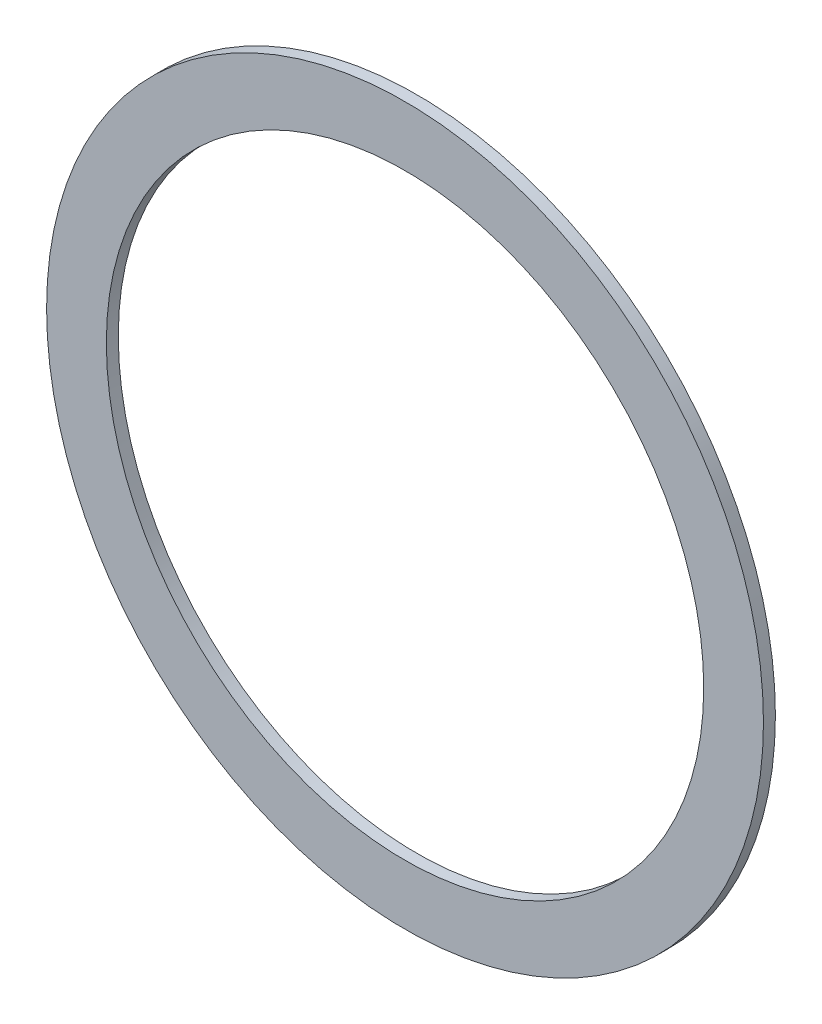
ISO-10303-21;
HEADER;
FILE_DESCRIPTION(('STEP AP214'),'2;1');
FILE_NAME('part.step','',(''),(''),'','','');
FILE_SCHEMA(('AUTOMOTIVE_DESIGN { 1 0 10303 214 1 1 1 1 }'));
ENDSEC;
DATA;
#1=APPLICATION_CONTEXT('core data for automotive mechanical design processes');
#2=APPLICATION_PROTOCOL_DEFINITION('international standard','automotive_design',2000,#1);
#3=PRODUCT_CONTEXT('',#1,'mechanical');
#4=PRODUCT('Part','Part','',(#3));
#5=PRODUCT_RELATED_PRODUCT_CATEGORY('part','',(#4));
#6=PRODUCT_DEFINITION_FORMATION('','',#4);
#7=PRODUCT_DEFINITION_CONTEXT('part definition',#1,'design');
#8=PRODUCT_DEFINITION('design','',#6,#7);
#9=PRODUCT_DEFINITION_SHAPE('','',#8);
#10=(LENGTH_UNIT() NAMED_UNIT(*) SI_UNIT(.MILLI.,.METRE.));
#11=(NAMED_UNIT(*) PLANE_ANGLE_UNIT() SI_UNIT($,.RADIAN.));
#12=(NAMED_UNIT(*) SI_UNIT($,.STERADIAN.) SOLID_ANGLE_UNIT());
#13=UNCERTAINTY_MEASURE_WITH_UNIT(LENGTH_MEASURE(1.E-05),#10,'distance_accuracy_value','');
#14=(GEOMETRIC_REPRESENTATION_CONTEXT(3) GLOBAL_UNCERTAINTY_ASSIGNED_CONTEXT((#13)) GLOBAL_UNIT_ASSIGNED_CONTEXT((#10,
#11,#12)) REPRESENTATION_CONTEXT('',''));
#15=CARTESIAN_POINT('',(0.,0.,0.));
#16=DIRECTION('',(0.,0.,1.));
#17=DIRECTION('',(1.,0.,0.));
#18=AXIS2_PLACEMENT_3D('',#15,#16,#17);
#19=CARTESIAN_POINT('',(0.,0.,0.1));
#20=DIRECTION('',(0.,0.,1.));
#21=DIRECTION('',(1.,0.,0.));
#22=AXIS2_PLACEMENT_3D('',#19,#20,#21);
#23=PLANE('',#22);
#24=CARTESIAN_POINT('',(0.,0.,0.1));
#25=DIRECTION('',(0.,0.,1.));
#26=DIRECTION('',(1.,0.,0.));
#27=AXIS2_PLACEMENT_3D('',#24,#25,#26);
#28=CIRCLE('',#27,6.);
#29=CARTESIAN_POINT('',(6.,0.,0.1));
#30=VERTEX_POINT('',#29);
#31=EDGE_CURVE('E10',#30,#30,#28,.T.);
#32=ORIENTED_EDGE('',*,*,#31,.T.);
#33=EDGE_LOOP('',(#32));
#34=FACE_BOUND('',#33,.T.);
#35=CARTESIAN_POINT('',(0.,0.,0.1));
#36=DIRECTION('',(0.,0.,1.));
#37=DIRECTION('',(1.,0.,0.));
#38=AXIS2_PLACEMENT_3D('',#35,#36,#37);
#39=CIRCLE('',#38,5.);
#40=CARTESIAN_POINT('',(5.,0.,0.1));
#41=VERTEX_POINT('',#40);
#42=EDGE_CURVE('E42',#41,#41,#39,.T.);
#43=ORIENTED_EDGE('',*,*,#42,.F.);
#44=EDGE_LOOP('',(#43));
#45=FACE_BOUND('',#44,.T.);
#46=ADVANCED_FACE('F31',(#34,#45),#23,.T.);
#47=CARTESIAN_POINT('',(0.,0.,-0.1));
#48=DIRECTION('',(0.,0.,1.));
#49=DIRECTION('',(1.,0.,0.));
#50=AXIS2_PLACEMENT_3D('',#47,#48,#49);
#51=PLANE('',#50);
#52=CARTESIAN_POINT('',(0.,0.,-0.1));
#53=DIRECTION('',(0.,0.,1.));
#54=DIRECTION('',(1.,0.,0.));
#55=AXIS2_PLACEMENT_3D('',#52,#53,#54);
#56=CIRCLE('',#55,6.);
#57=CARTESIAN_POINT('',(6.,0.,-0.1));
#58=VERTEX_POINT('',#57);
#59=EDGE_CURVE('E35',#58,#58,#56,.T.);
#60=ORIENTED_EDGE('',*,*,#59,.F.);
#61=EDGE_LOOP('',(#60));
#62=FACE_BOUND('',#61,.T.);
#63=CARTESIAN_POINT('',(0.,0.,-0.1));
#64=DIRECTION('',(0.,0.,1.));
#65=DIRECTION('',(1.,0.,0.));
#66=AXIS2_PLACEMENT_3D('',#63,#64,#65);
#67=CIRCLE('',#66,5.);
#68=CARTESIAN_POINT('',(5.,0.,-0.1));
#69=VERTEX_POINT('',#68);
#70=EDGE_CURVE('E44',#69,#69,#67,.T.);
#71=ORIENTED_EDGE('',*,*,#70,.T.);
#72=EDGE_LOOP('',(#71));
#73=FACE_BOUND('',#72,.T.);
#74=ADVANCED_FACE('F54',(#62,#73),#51,.F.);
#75=CARTESIAN_POINT('',(0.,0.,0.1));
#76=DIRECTION('',(0.,0.,-1.));
#77=DIRECTION('',(-1.,0.,0.));
#78=AXIS2_PLACEMENT_3D('',#75,#76,#77);
#79=CYLINDRICAL_SURFACE('',#78,6.);
#80=ORIENTED_EDGE('',*,*,#31,.F.);
#81=EDGE_LOOP('',(#80));
#82=FACE_BOUND('',#81,.T.);
#83=ORIENTED_EDGE('',*,*,#59,.T.);
#84=EDGE_LOOP('',(#83));
#85=FACE_BOUND('',#84,.T.);
#86=ADVANCED_FACE('F33',(#82,#85),#79,.T.);
#87=CARTESIAN_POINT('',(0.,0.,0.1));
#88=DIRECTION('',(0.,0.,-1.));
#89=DIRECTION('',(-1.,0.,0.));
#90=AXIS2_PLACEMENT_3D('',#87,#88,#89);
#91=CYLINDRICAL_SURFACE('',#90,5.);
#92=ORIENTED_EDGE('',*,*,#42,.T.);
#93=EDGE_LOOP('',(#92));
#94=FACE_BOUND('',#93,.T.);
#95=ORIENTED_EDGE('',*,*,#70,.F.);
#96=EDGE_LOOP('',(#95));
#97=FACE_BOUND('',#96,.T.);
#98=ADVANCED_FACE('F50',(#94,#97),#91,.F.);
#99=CLOSED_SHELL('',(#46,#74,#86,#98));
#100=MANIFOLD_SOLID_BREP('B2',#99);
#101=ADVANCED_BREP_SHAPE_REPRESENTATION('',(#18,#100),#14);
#102=SHAPE_DEFINITION_REPRESENTATION(#9,#101);
ENDSEC;
END-ISO-10303-21;
